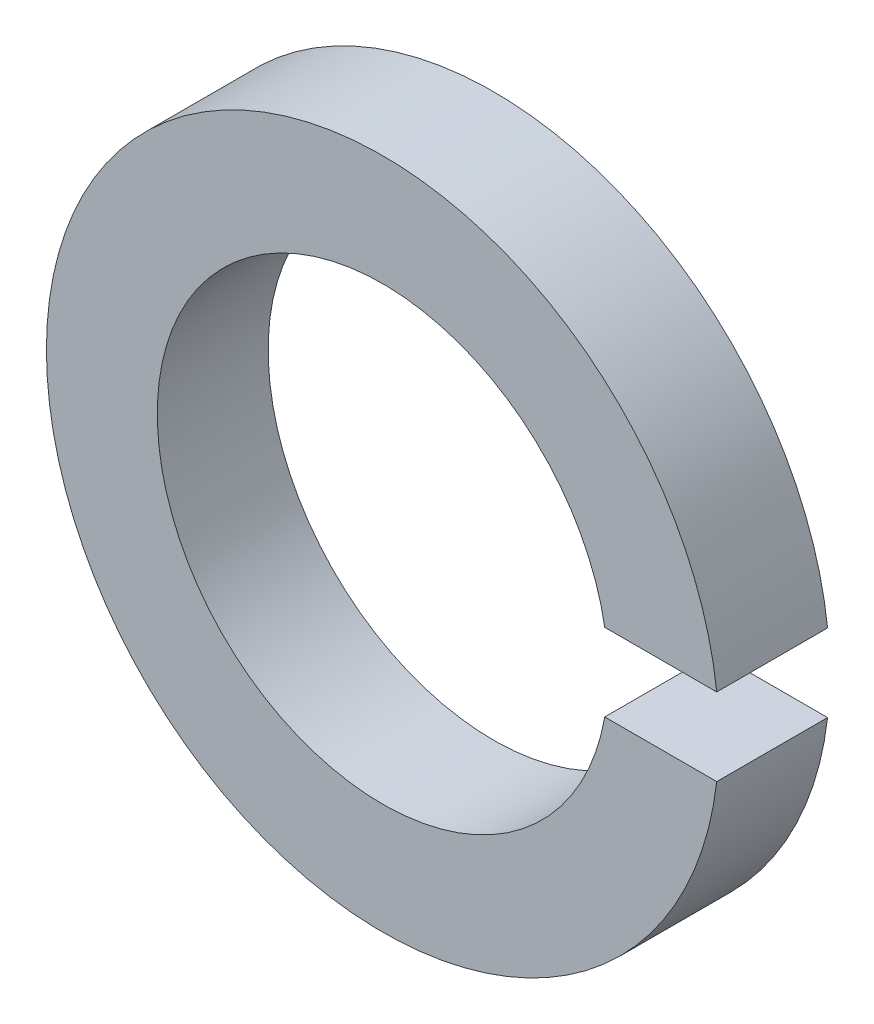
ISO-10303-21;
HEADER;
FILE_DESCRIPTION(('STEP AP214'),'2;1');
FILE_NAME('part.step','',(''),(''),'','','');
FILE_SCHEMA(('AUTOMOTIVE_DESIGN { 1 0 10303 214 1 1 1 1 }'));
ENDSEC;
DATA;
#1=APPLICATION_CONTEXT('core data for automotive mechanical design processes');
#2=APPLICATION_PROTOCOL_DEFINITION('international standard','automotive_design',2000,#1);
#3=PRODUCT_CONTEXT('',#1,'mechanical');
#4=PRODUCT('Part','Part','',(#3));
#5=PRODUCT_RELATED_PRODUCT_CATEGORY('part','',(#4));
#6=PRODUCT_DEFINITION_FORMATION('','',#4);
#7=PRODUCT_DEFINITION_CONTEXT('part definition',#1,'design');
#8=PRODUCT_DEFINITION('design','',#6,#7);
#9=PRODUCT_DEFINITION_SHAPE('','',#8);
#10=(LENGTH_UNIT() NAMED_UNIT(*) SI_UNIT(.MILLI.,.METRE.));
#11=(NAMED_UNIT(*) PLANE_ANGLE_UNIT() SI_UNIT($,.RADIAN.));
#12=(NAMED_UNIT(*) SI_UNIT($,.STERADIAN.) SOLID_ANGLE_UNIT());
#13=UNCERTAINTY_MEASURE_WITH_UNIT(LENGTH_MEASURE(1.E-05),#10,'distance_accuracy_value','');
#14=(GEOMETRIC_REPRESENTATION_CONTEXT(3) GLOBAL_UNCERTAINTY_ASSIGNED_CONTEXT((#13)) GLOBAL_UNIT_ASSIGNED_CONTEXT((#10,
#11,#12)) REPRESENTATION_CONTEXT('',''));
#15=CARTESIAN_POINT('',(0.,0.,0.));
#16=DIRECTION('',(0.,0.,1.));
#17=DIRECTION('',(1.,0.,0.));
#18=AXIS2_PLACEMENT_3D('',#15,#16,#17);
#19=CARTESIAN_POINT('',(0.,0.,3.));
#20=DIRECTION('',(0.,0.,1.));
#21=DIRECTION('',(1.,0.,0.));
#22=AXIS2_PLACEMENT_3D('',#19,#20,#21);
#23=PLANE('',#22);
#24=DIRECTION('',(-1.,0.,0.));
#25=VECTOR('',#24,1.);
#26=CARTESIAN_POINT('',(5.81071044181663,1.05,3.));
#27=LINE('',#26,#25);
#28=CARTESIAN_POINT('',(9.03922009910147,1.05,3.));
#29=VERTEX_POINT('',#28);
#30=CARTESIAN_POINT('',(6.00895165565509,1.05,3.));
#31=VERTEX_POINT('',#30);
#32=EDGE_CURVE('E51',#29,#31,#27,.T.);
#33=ORIENTED_EDGE('',*,*,#32,.F.);
#34=CARTESIAN_POINT('',(0.,0.,3.));
#35=DIRECTION('',(0.,0.,1.));
#36=DIRECTION('',(1.,0.,0.));
#37=AXIS2_PLACEMENT_3D('',#34,#35,#36);
#38=CIRCLE('',#37,9.1);
#39=CARTESIAN_POINT('',(9.03922009910147,-1.05,3.));
#40=VERTEX_POINT('',#39);
#41=EDGE_CURVE('E74',#29,#40,#38,.T.);
#42=ORIENTED_EDGE('',*,*,#41,.T.);
#43=DIRECTION('',(1.,0.,0.));
#44=VECTOR('',#43,1.);
#45=CARTESIAN_POINT('',(5.81071044181663,-1.05,3.));
#46=LINE('',#45,#44);
#47=CARTESIAN_POINT('',(6.00895165565509,-1.05,3.));
#48=VERTEX_POINT('',#47);
#49=EDGE_CURVE('E68',#48,#40,#46,.T.);
#50=ORIENTED_EDGE('',*,*,#49,.F.);
#51=CARTESIAN_POINT('',(0.,0.,3.));
#52=DIRECTION('',(0.,0.,1.));
#53=DIRECTION('',(1.,0.,0.));
#54=AXIS2_PLACEMENT_3D('',#51,#52,#53);
#55=CIRCLE('',#54,6.1);
#56=EDGE_CURVE('E78',#31,#48,#55,.T.);
#57=ORIENTED_EDGE('',*,*,#56,.F.);
#58=EDGE_LOOP('',(#33,#42,#50,#57));
#59=FACE_BOUND('',#58,.T.);
#60=ADVANCED_FACE('F29',(#59),#23,.T.);
#61=CARTESIAN_POINT('',(0.,0.,0.));
#62=DIRECTION('',(0.,0.,1.));
#63=DIRECTION('',(1.,0.,0.));
#64=AXIS2_PLACEMENT_3D('',#61,#62,#63);
#65=PLANE('',#64);
#66=CARTESIAN_POINT('',(0.,0.,0.));
#67=DIRECTION('',(0.,0.,1.));
#68=DIRECTION('',(1.,0.,0.));
#69=AXIS2_PLACEMENT_3D('',#66,#67,#68);
#70=CIRCLE('',#69,9.1);
#71=CARTESIAN_POINT('',(9.03922009910147,1.05,0.));
#72=VERTEX_POINT('',#71);
#73=CARTESIAN_POINT('',(9.03922009910147,-1.05,0.));
#74=VERTEX_POINT('',#73);
#75=EDGE_CURVE('E82',#72,#74,#70,.T.);
#76=ORIENTED_EDGE('',*,*,#75,.F.);
#77=DIRECTION('',(-1.,0.,0.));
#78=VECTOR('',#77,1.);
#79=CARTESIAN_POINT('',(5.81071044181663,1.05,0.));
#80=LINE('',#79,#78);
#81=CARTESIAN_POINT('',(6.00895165565509,1.05,0.));
#82=VERTEX_POINT('',#81);
#83=EDGE_CURVE('E95',#72,#82,#80,.T.);
#84=ORIENTED_EDGE('',*,*,#83,.T.);
#85=CARTESIAN_POINT('',(0.,0.,0.));
#86=DIRECTION('',(0.,0.,1.));
#87=DIRECTION('',(1.,0.,0.));
#88=AXIS2_PLACEMENT_3D('',#85,#86,#87);
#89=CIRCLE('',#88,6.1);
#90=CARTESIAN_POINT('',(6.00895165565509,-1.05,0.));
#91=VERTEX_POINT('',#90);
#92=EDGE_CURVE('E83',#82,#91,#89,.T.);
#93=ORIENTED_EDGE('',*,*,#92,.T.);
#94=DIRECTION('',(1.,0.,0.));
#95=VECTOR('',#94,1.);
#96=CARTESIAN_POINT('',(5.81071044181663,-1.05,0.));
#97=LINE('',#96,#95);
#98=EDGE_CURVE('E44',#91,#74,#97,.T.);
#99=ORIENTED_EDGE('',*,*,#98,.T.);
#100=EDGE_LOOP('',(#76,#84,#93,#99));
#101=FACE_BOUND('',#100,.T.);
#102=ADVANCED_FACE('F101',(#101),#65,.F.);
#103=CARTESIAN_POINT('',(0.,0.,3.));
#104=DIRECTION('',(0.,0.,-1.));
#105=DIRECTION('',(-1.,0.,0.));
#106=AXIS2_PLACEMENT_3D('',#103,#104,#105);
#107=CYLINDRICAL_SURFACE('',#106,9.1);
#108=ORIENTED_EDGE('',*,*,#41,.F.);
#109=DIRECTION('',(0.,0.,-1.));
#110=VECTOR('',#109,1.);
#111=CARTESIAN_POINT('',(9.03922009910147,1.05,3.));
#112=LINE('',#111,#110);
#113=EDGE_CURVE('E87',#29,#72,#112,.T.);
#114=ORIENTED_EDGE('',*,*,#113,.T.);
#115=ORIENTED_EDGE('',*,*,#75,.T.);
#116=DIRECTION('',(0.,0.,-1.));
#117=VECTOR('',#116,1.);
#118=CARTESIAN_POINT('',(9.03922009910147,-1.05,3.));
#119=LINE('',#118,#117);
#120=EDGE_CURVE('E93',#74,#40,#119,.F.);
#121=ORIENTED_EDGE('',*,*,#120,.T.);
#122=EDGE_LOOP('',(#108,#114,#115,#121));
#123=FACE_BOUND('',#122,.T.);
#124=ADVANCED_FACE('F31',(#123),#107,.T.);
#125=CARTESIAN_POINT('',(0.,0.,3.));
#126=DIRECTION('',(0.,0.,-1.));
#127=DIRECTION('',(-1.,0.,0.));
#128=AXIS2_PLACEMENT_3D('',#125,#126,#127);
#129=CYLINDRICAL_SURFACE('',#128,6.1);
#130=DIRECTION('',(0.,0.,-1.));
#131=VECTOR('',#130,1.);
#132=CARTESIAN_POINT('',(6.00895165565509,1.05,3.));
#133=LINE('',#132,#131);
#134=EDGE_CURVE('E11',#31,#82,#133,.T.);
#135=ORIENTED_EDGE('',*,*,#134,.F.);
#136=ORIENTED_EDGE('',*,*,#56,.T.);
#137=DIRECTION('',(0.,0.,-1.));
#138=VECTOR('',#137,1.);
#139=CARTESIAN_POINT('',(6.00895165565509,-1.05,3.));
#140=LINE('',#139,#138);
#141=EDGE_CURVE('E37',#91,#48,#140,.F.);
#142=ORIENTED_EDGE('',*,*,#141,.F.);
#143=ORIENTED_EDGE('',*,*,#92,.F.);
#144=EDGE_LOOP('',(#135,#136,#142,#143));
#145=FACE_BOUND('',#144,.T.);
#146=ADVANCED_FACE('F81',(#145),#129,.F.);
#147=CARTESIAN_POINT('',(5.81071044181663,-1.05,0.));
#148=DIRECTION('',(0.,-1.,0.));
#149=DIRECTION('',(0.,0.,-1.));
#150=AXIS2_PLACEMENT_3D('',#147,#148,#149);
#151=PLANE('',#150);
#152=ORIENTED_EDGE('',*,*,#98,.F.);
#153=ORIENTED_EDGE('',*,*,#141,.T.);
#154=ORIENTED_EDGE('',*,*,#49,.T.);
#155=ORIENTED_EDGE('',*,*,#120,.F.);
#156=EDGE_LOOP('',(#152,#153,#154,#155));
#157=FACE_BOUND('',#156,.T.);
#158=ADVANCED_FACE('F67',(#157),#151,.F.);
#159=CARTESIAN_POINT('',(5.81071044181663,1.05,0.));
#160=DIRECTION('',(0.,1.,0.));
#161=DIRECTION('',(0.,0.,1.));
#162=AXIS2_PLACEMENT_3D('',#159,#160,#161);
#163=PLANE('',#162);
#164=ORIENTED_EDGE('',*,*,#32,.T.);
#165=ORIENTED_EDGE('',*,*,#134,.T.);
#166=ORIENTED_EDGE('',*,*,#83,.F.);
#167=ORIENTED_EDGE('',*,*,#113,.F.);
#168=EDGE_LOOP('',(#164,#165,#166,#167));
#169=FACE_BOUND('',#168,.T.);
#170=ADVANCED_FACE('F103',(#169),#163,.F.);
#171=CLOSED_SHELL('',(#60,#102,#124,#146,#158,#170));
#172=MANIFOLD_SOLID_BREP('B2',#171);
#173=ADVANCED_BREP_SHAPE_REPRESENTATION('',(#18,#172),#14);
#174=SHAPE_DEFINITION_REPRESENTATION(#9,#173);
ENDSEC;
END-ISO-10303-21;
